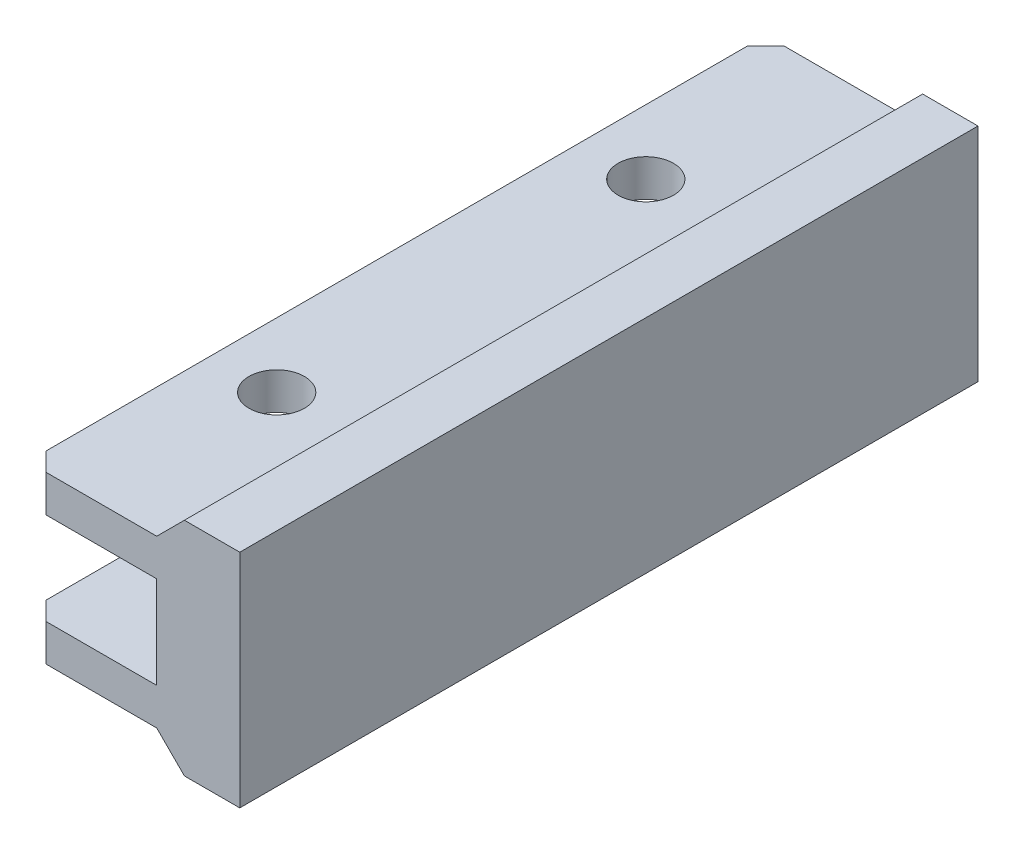
ISO-10303-21;
HEADER;
FILE_DESCRIPTION(('STEP AP214'),'2;1');
FILE_NAME('part.step','',(''),(''),'','','');
FILE_SCHEMA(('AUTOMOTIVE_DESIGN { 1 0 10303 214 1 1 1 1 }'));
ENDSEC;
DATA;
#1=APPLICATION_CONTEXT('core data for automotive mechanical design processes');
#2=APPLICATION_PROTOCOL_DEFINITION('international standard','automotive_design',2000,#1);
#3=PRODUCT_CONTEXT('',#1,'mechanical');
#4=PRODUCT('Part','Part','',(#3));
#5=PRODUCT_RELATED_PRODUCT_CATEGORY('part','',(#4));
#6=PRODUCT_DEFINITION_FORMATION('','',#4);
#7=PRODUCT_DEFINITION_CONTEXT('part definition',#1,'design');
#8=PRODUCT_DEFINITION('design','',#6,#7);
#9=PRODUCT_DEFINITION_SHAPE('','',#8);
#10=(LENGTH_UNIT() NAMED_UNIT(*) SI_UNIT(.MILLI.,.METRE.));
#11=(NAMED_UNIT(*) PLANE_ANGLE_UNIT() SI_UNIT($,.RADIAN.));
#12=(NAMED_UNIT(*) SI_UNIT($,.STERADIAN.) SOLID_ANGLE_UNIT());
#13=UNCERTAINTY_MEASURE_WITH_UNIT(LENGTH_MEASURE(1.E-05),#10,'distance_accuracy_value','');
#14=(GEOMETRIC_REPRESENTATION_CONTEXT(3) GLOBAL_UNCERTAINTY_ASSIGNED_CONTEXT((#13)) GLOBAL_UNIT_ASSIGNED_CONTEXT((#10,
#11,#12)) REPRESENTATION_CONTEXT('',''));
#15=CARTESIAN_POINT('',(0.,0.,0.));
#16=DIRECTION('',(0.,0.,1.));
#17=DIRECTION('',(1.,0.,0.));
#18=AXIS2_PLACEMENT_3D('',#15,#16,#17);
#19=CARTESIAN_POINT('',(0.,6.,20.));
#20=DIRECTION('',(0.,-1.,0.));
#21=DIRECTION('',(0.,0.,-1.));
#22=AXIS2_PLACEMENT_3D('',#19,#20,#21);
#23=PLANE('',#22);
#24=DIRECTION('',(-1.,0.,0.));
#25=VECTOR('',#24,1.);
#26=CARTESIAN_POINT('',(0.,6.,-20.));
#27=LINE('',#26,#25);
#28=CARTESIAN_POINT('',(0.,6.,-20.));
#29=VERTEX_POINT('',#28);
#30=CARTESIAN_POINT('',(-3.00000000000001,6.,-20.));
#31=VERTEX_POINT('',#30);
#32=EDGE_CURVE('E183',#29,#31,#27,.T.);
#33=ORIENTED_EDGE('',*,*,#32,.T.);
#34=DIRECTION('',(0.,0.,-1.));
#35=VECTOR('',#34,1.);
#36=CARTESIAN_POINT('',(-3.00000000000001,6.,20.));
#37=LINE('',#36,#35);
#38=CARTESIAN_POINT('',(-3.00000000000001,6.,20.));
#39=VERTEX_POINT('',#38);
#40=EDGE_CURVE('E165',#39,#31,#37,.T.);
#41=ORIENTED_EDGE('',*,*,#40,.F.);
#42=DIRECTION('',(-1.,0.,0.));
#43=VECTOR('',#42,1.);
#44=CARTESIAN_POINT('',(0.,6.,20.));
#45=LINE('',#44,#43);
#46=CARTESIAN_POINT('',(0.,6.,20.));
#47=VERTEX_POINT('',#46);
#48=EDGE_CURVE('E171',#47,#39,#45,.T.);
#49=ORIENTED_EDGE('',*,*,#48,.F.);
#50=DIRECTION('',(0.,0.,-1.));
#51=VECTOR('',#50,1.);
#52=CARTESIAN_POINT('',(0.,6.,20.));
#53=LINE('',#52,#51);
#54=EDGE_CURVE('E253',#47,#29,#53,.T.);
#55=ORIENTED_EDGE('',*,*,#54,.T.);
#56=EDGE_LOOP('',(#33,#41,#49,#55));
#57=FACE_BOUND('',#56,.T.);
#58=ADVANCED_FACE('F45',(#57),#23,.F.);
#59=CARTESIAN_POINT('',(-3.00000000000001,6.,20.));
#60=DIRECTION('',(0.707106781186549,-0.707106781186546,0.));
#61=DIRECTION('',(0.707106781186546,0.707106781186549,0.));
#62=AXIS2_PLACEMENT_3D('',#59,#60,#61);
#63=PLANE('',#62);
#64=DIRECTION('',(-0.707106781186546,-0.707106781186549,0.));
#65=VECTOR('',#64,1.);
#66=CARTESIAN_POINT('',(-3.00000000000001,6.,-20.));
#67=LINE('',#66,#65);
#68=CARTESIAN_POINT('',(-4.5,4.5,-20.));
#69=VERTEX_POINT('',#68);
#70=EDGE_CURVE('E255',#31,#69,#67,.T.);
#71=ORIENTED_EDGE('',*,*,#70,.T.);
#72=DIRECTION('',(0.,0.,-1.));
#73=VECTOR('',#72,1.);
#74=CARTESIAN_POINT('',(-4.5,4.5,20.));
#75=LINE('',#74,#73);
#76=CARTESIAN_POINT('',(-4.5,4.5,20.));
#77=VERTEX_POINT('',#76);
#78=EDGE_CURVE('E168',#77,#69,#75,.T.);
#79=ORIENTED_EDGE('',*,*,#78,.F.);
#80=DIRECTION('',(-0.707106781186546,-0.707106781186549,0.));
#81=VECTOR('',#80,1.);
#82=CARTESIAN_POINT('',(-3.00000000000001,6.,20.));
#83=LINE('',#82,#81);
#84=EDGE_CURVE('E161',#39,#77,#83,.T.);
#85=ORIENTED_EDGE('',*,*,#84,.F.);
#86=ORIENTED_EDGE('',*,*,#40,.T.);
#87=EDGE_LOOP('',(#71,#79,#85,#86));
#88=FACE_BOUND('',#87,.T.);
#89=ADVANCED_FACE('F163',(#88),#63,.F.);
#90=CARTESIAN_POINT('',(-4.5,4.5,20.));
#91=DIRECTION('',(0.,-1.,0.));
#92=DIRECTION('',(0.,0.,-1.));
#93=AXIS2_PLACEMENT_3D('',#90,#91,#92);
#94=PLANE('',#93);
#95=CARTESIAN_POINT('',(-8.,4.5,10.));
#96=DIRECTION('',(0.,1.,0.));
#97=DIRECTION('',(0.,0.,1.));
#98=AXIS2_PLACEMENT_3D('',#95,#96,#97);
#99=CIRCLE('',#98,1.5);
#100=CARTESIAN_POINT('',(-8.,4.5,11.5));
#101=VERTEX_POINT('',#100);
#102=EDGE_CURVE('E200',#101,#101,#99,.T.);
#103=ORIENTED_EDGE('',*,*,#102,.F.);
#104=EDGE_LOOP('',(#103));
#105=FACE_BOUND('',#104,.T.);
#106=CARTESIAN_POINT('',(-8.,4.5,-10.));
#107=DIRECTION('',(0.,1.,0.));
#108=DIRECTION('',(0.,0.,1.));
#109=AXIS2_PLACEMENT_3D('',#106,#107,#108);
#110=CIRCLE('',#109,1.5);
#111=CARTESIAN_POINT('',(-8.,4.5,-8.5));
#112=VERTEX_POINT('',#111);
#113=EDGE_CURVE('E196',#112,#112,#110,.T.);
#114=ORIENTED_EDGE('',*,*,#113,.F.);
#115=EDGE_LOOP('',(#114));
#116=FACE_BOUND('',#115,.T.);
#117=DIRECTION('',(-1.,0.,0.));
#118=VECTOR('',#117,1.);
#119=CARTESIAN_POINT('',(-4.5,4.5,-20.));
#120=LINE('',#119,#118);
#121=CARTESIAN_POINT('',(-10.5,4.5,-20.));
#122=VERTEX_POINT('',#121);
#123=EDGE_CURVE('E258',#69,#122,#120,.T.);
#124=ORIENTED_EDGE('',*,*,#123,.T.);
#125=DIRECTION('',(0.707106781186548,0.,-0.707106781186548));
#126=VECTOR('',#125,1.);
#127=CARTESIAN_POINT('',(-11.5,4.5,-19.));
#128=LINE('',#127,#126);
#129=CARTESIAN_POINT('',(-11.5,4.5,-19.));
#130=VERTEX_POINT('',#129);
#131=EDGE_CURVE('E225',#122,#130,#128,.F.);
#132=ORIENTED_EDGE('',*,*,#131,.T.);
#133=DIRECTION('',(0.,0.,-1.));
#134=VECTOR('',#133,1.);
#135=CARTESIAN_POINT('',(-11.5,4.5,20.));
#136=LINE('',#135,#134);
#137=CARTESIAN_POINT('',(-11.5,4.5,19.));
#138=VERTEX_POINT('',#137);
#139=EDGE_CURVE('E188',#138,#130,#136,.T.);
#140=ORIENTED_EDGE('',*,*,#139,.F.);
#141=DIRECTION('',(0.707106781186548,0.,0.707106781186548));
#142=VECTOR('',#141,1.);
#143=CARTESIAN_POINT('',(-10.5,4.5,20.));
#144=LINE('',#143,#142);
#145=CARTESIAN_POINT('',(-10.5,4.5,20.));
#146=VERTEX_POINT('',#145);
#147=EDGE_CURVE('E61',#138,#146,#144,.T.);
#148=ORIENTED_EDGE('',*,*,#147,.T.);
#149=DIRECTION('',(-1.,0.,0.));
#150=VECTOR('',#149,1.);
#151=CARTESIAN_POINT('',(-4.5,4.5,20.));
#152=LINE('',#151,#150);
#153=EDGE_CURVE('E170',#77,#146,#152,.T.);
#154=ORIENTED_EDGE('',*,*,#153,.F.);
#155=ORIENTED_EDGE('',*,*,#78,.T.);
#156=EDGE_LOOP('',(#124,#132,#140,#148,#154,#155));
#157=FACE_BOUND('',#156,.T.);
#158=ADVANCED_FACE('F351',(#105,#116,#157),#94,.F.);
#159=CARTESIAN_POINT('',(-11.5,4.5,20.));
#160=DIRECTION('',(1.,0.,0.));
#161=DIRECTION('',(0.,0.,-1.));
#162=AXIS2_PLACEMENT_3D('',#159,#160,#161);
#163=PLANE('',#162);
#164=ORIENTED_EDGE('',*,*,#139,.T.);
#165=DIRECTION('',(0.,-1.,0.));
#166=VECTOR('',#165,1.);
#167=CARTESIAN_POINT('',(-11.5,4.5,-19.));
#168=LINE('',#167,#166);
#169=CARTESIAN_POINT('',(-11.5,2.5,-19.));
#170=VERTEX_POINT('',#169);
#171=EDGE_CURVE('E218',#130,#170,#168,.T.);
#172=ORIENTED_EDGE('',*,*,#171,.T.);
#173=DIRECTION('',(0.,0.,-1.));
#174=VECTOR('',#173,1.);
#175=CARTESIAN_POINT('',(-11.5,2.5,20.));
#176=LINE('',#175,#174);
#177=CARTESIAN_POINT('',(-11.5,2.5,19.));
#178=VERTEX_POINT('',#177);
#179=EDGE_CURVE('E294',#178,#170,#176,.T.);
#180=ORIENTED_EDGE('',*,*,#179,.F.);
#181=DIRECTION('',(0.,1.,0.));
#182=VECTOR('',#181,1.);
#183=CARTESIAN_POINT('',(-11.5,4.5,19.));
#184=LINE('',#183,#182);
#185=EDGE_CURVE('E216',#178,#138,#184,.T.);
#186=ORIENTED_EDGE('',*,*,#185,.T.);
#187=EDGE_LOOP('',(#164,#172,#180,#186));
#188=FACE_BOUND('',#187,.T.);
#189=ADVANCED_FACE('F299',(#188),#163,.F.);
#190=CARTESIAN_POINT('',(-4.5,2.5,20.));
#191=DIRECTION('',(0.,1.,0.));
#192=DIRECTION('',(0.,0.,1.));
#193=AXIS2_PLACEMENT_3D('',#190,#191,#192);
#194=PLANE('',#193);
#195=CARTESIAN_POINT('',(-8.,2.5,10.));
#196=DIRECTION('',(0.,1.,0.));
#197=DIRECTION('',(0.,0.,1.));
#198=AXIS2_PLACEMENT_3D('',#195,#196,#197);
#199=CIRCLE('',#198,1.5);
#200=CARTESIAN_POINT('',(-8.,2.5,11.5));
#201=VERTEX_POINT('',#200);
#202=EDGE_CURVE('E554',#201,#201,#199,.T.);
#203=ORIENTED_EDGE('',*,*,#202,.T.);
#204=EDGE_LOOP('',(#203));
#205=FACE_BOUND('',#204,.T.);
#206=CARTESIAN_POINT('',(-8.,2.5,-10.));
#207=DIRECTION('',(0.,1.,0.));
#208=DIRECTION('',(0.,0.,1.));
#209=AXIS2_PLACEMENT_3D('',#206,#207,#208);
#210=CIRCLE('',#209,1.5);
#211=CARTESIAN_POINT('',(-8.,2.5,-8.5));
#212=VERTEX_POINT('',#211);
#213=EDGE_CURVE('E256',#212,#212,#210,.T.);
#214=ORIENTED_EDGE('',*,*,#213,.T.);
#215=EDGE_LOOP('',(#214));
#216=FACE_BOUND('',#215,.T.);
#217=ORIENTED_EDGE('',*,*,#179,.T.);
#218=DIRECTION('',(-0.707106781186548,0.,0.707106781186548));
#219=VECTOR('',#218,1.);
#220=CARTESIAN_POINT('',(-11.5,2.5,-19.));
#221=LINE('',#220,#219);
#222=CARTESIAN_POINT('',(-10.5,2.5,-20.));
#223=VERTEX_POINT('',#222);
#224=EDGE_CURVE('E222',#170,#223,#221,.F.);
#225=ORIENTED_EDGE('',*,*,#224,.T.);
#226=DIRECTION('',(1.,0.,0.));
#227=VECTOR('',#226,1.);
#228=CARTESIAN_POINT('',(-4.5,2.5,-20.));
#229=LINE('',#228,#227);
#230=CARTESIAN_POINT('',(-4.5,2.5,-20.));
#231=VERTEX_POINT('',#230);
#232=EDGE_CURVE('E261',#223,#231,#229,.T.);
#233=ORIENTED_EDGE('',*,*,#232,.T.);
#234=DIRECTION('',(0.,0.,-1.));
#235=VECTOR('',#234,1.);
#236=CARTESIAN_POINT('',(-4.5,2.5,20.));
#237=LINE('',#236,#235);
#238=CARTESIAN_POINT('',(-4.5,2.5,20.));
#239=VERTEX_POINT('',#238);
#240=EDGE_CURVE('E291',#239,#231,#237,.T.);
#241=ORIENTED_EDGE('',*,*,#240,.F.);
#242=DIRECTION('',(1.,0.,0.));
#243=VECTOR('',#242,1.);
#244=CARTESIAN_POINT('',(-4.5,2.5,20.));
#245=LINE('',#244,#243);
#246=CARTESIAN_POINT('',(-10.5,2.5,20.));
#247=VERTEX_POINT('',#246);
#248=EDGE_CURVE('E409',#247,#239,#245,.T.);
#249=ORIENTED_EDGE('',*,*,#248,.F.);
#250=DIRECTION('',(-0.707106781186548,0.,-0.707106781186548));
#251=VECTOR('',#250,1.);
#252=CARTESIAN_POINT('',(-10.5,2.5,20.));
#253=LINE('',#252,#251);
#254=EDGE_CURVE('E69',#247,#178,#253,.T.);
#255=ORIENTED_EDGE('',*,*,#254,.T.);
#256=EDGE_LOOP('',(#217,#225,#233,#241,#249,#255));
#257=FACE_BOUND('',#256,.T.);
#258=ADVANCED_FACE('F307',(#205,#216,#257),#194,.F.);
#259=CARTESIAN_POINT('',(-4.5,-2.5,20.));
#260=DIRECTION('',(1.,0.,0.));
#261=DIRECTION('',(0.,0.,-1.));
#262=AXIS2_PLACEMENT_3D('',#259,#260,#261);
#263=PLANE('',#262);
#264=DIRECTION('',(0.,-1.,0.));
#265=VECTOR('',#264,1.);
#266=CARTESIAN_POINT('',(-4.5,-2.5,-20.));
#267=LINE('',#266,#265);
#268=CARTESIAN_POINT('',(-4.5,-2.5,-20.));
#269=VERTEX_POINT('',#268);
#270=EDGE_CURVE('E263',#231,#269,#267,.T.);
#271=ORIENTED_EDGE('',*,*,#270,.T.);
#272=DIRECTION('',(0.,0.,-1.));
#273=VECTOR('',#272,1.);
#274=CARTESIAN_POINT('',(-4.5,-2.5,20.));
#275=LINE('',#274,#273);
#276=CARTESIAN_POINT('',(-4.5,-2.5,20.));
#277=VERTEX_POINT('',#276);
#278=EDGE_CURVE('E288',#277,#269,#275,.T.);
#279=ORIENTED_EDGE('',*,*,#278,.F.);
#280=DIRECTION('',(0.,-1.,0.));
#281=VECTOR('',#280,1.);
#282=CARTESIAN_POINT('',(-4.5,-2.5,20.));
#283=LINE('',#282,#281);
#284=EDGE_CURVE('E247',#239,#277,#283,.T.);
#285=ORIENTED_EDGE('',*,*,#284,.F.);
#286=ORIENTED_EDGE('',*,*,#240,.T.);
#287=EDGE_LOOP('',(#271,#279,#285,#286));
#288=FACE_BOUND('',#287,.T.);
#289=ADVANCED_FACE('F317',(#288),#263,.F.);
#290=CARTESIAN_POINT('',(-4.5,-2.5,20.));
#291=DIRECTION('',(0.,-1.,0.));
#292=DIRECTION('',(0.,0.,-1.));
#293=AXIS2_PLACEMENT_3D('',#290,#291,#292);
#294=PLANE('',#293);
#295=CARTESIAN_POINT('',(-8.,-2.5,10.));
#296=DIRECTION('',(0.,-1.,0.));
#297=DIRECTION('',(0.,0.,-1.));
#298=AXIS2_PLACEMENT_3D('',#295,#296,#297);
#299=CIRCLE('',#298,1.5);
#300=CARTESIAN_POINT('',(-8.,-2.5,8.5));
#301=VERTEX_POINT('',#300);
#302=EDGE_CURVE('E199',#301,#301,#299,.T.);
#303=ORIENTED_EDGE('',*,*,#302,.T.);
#304=EDGE_LOOP('',(#303));
#305=FACE_BOUND('',#304,.T.);
#306=CARTESIAN_POINT('',(-8.,-2.5,-10.));
#307=DIRECTION('',(0.,-1.,0.));
#308=DIRECTION('',(0.,0.,-1.));
#309=AXIS2_PLACEMENT_3D('',#306,#307,#308);
#310=CIRCLE('',#309,1.5);
#311=CARTESIAN_POINT('',(-8.,-2.5,-11.5));
#312=VERTEX_POINT('',#311);
#313=EDGE_CURVE('E195',#312,#312,#310,.T.);
#314=ORIENTED_EDGE('',*,*,#313,.T.);
#315=EDGE_LOOP('',(#314));
#316=FACE_BOUND('',#315,.T.);
#317=DIRECTION('',(-1.,0.,0.));
#318=VECTOR('',#317,1.);
#319=CARTESIAN_POINT('',(-4.5,-2.5,-20.));
#320=LINE('',#319,#318);
#321=CARTESIAN_POINT('',(-10.5,-2.5,-20.));
#322=VERTEX_POINT('',#321);
#323=EDGE_CURVE('E265',#269,#322,#320,.T.);
#324=ORIENTED_EDGE('',*,*,#323,.T.);
#325=DIRECTION('',(0.707106781186548,0.,-0.707106781186548));
#326=VECTOR('',#325,1.);
#327=CARTESIAN_POINT('',(-11.5,-2.5,-19.));
#328=LINE('',#327,#326);
#329=CARTESIAN_POINT('',(-11.5,-2.5,-19.));
#330=VERTEX_POINT('',#329);
#331=EDGE_CURVE('E214',#322,#330,#328,.F.);
#332=ORIENTED_EDGE('',*,*,#331,.T.);
#333=DIRECTION('',(0.,0.,-1.));
#334=VECTOR('',#333,1.);
#335=CARTESIAN_POINT('',(-11.5,-2.5,20.));
#336=LINE('',#335,#334);
#337=CARTESIAN_POINT('',(-11.5,-2.5,19.));
#338=VERTEX_POINT('',#337);
#339=EDGE_CURVE('E285',#338,#330,#336,.T.);
#340=ORIENTED_EDGE('',*,*,#339,.F.);
#341=DIRECTION('',(0.707106781186548,0.,0.707106781186548));
#342=VECTOR('',#341,1.);
#343=CARTESIAN_POINT('',(-10.5,-2.5,20.));
#344=LINE('',#343,#342);
#345=CARTESIAN_POINT('',(-10.5,-2.5,20.));
#346=VERTEX_POINT('',#345);
#347=EDGE_CURVE('E212',#338,#346,#344,.T.);
#348=ORIENTED_EDGE('',*,*,#347,.T.);
#349=DIRECTION('',(-1.,0.,0.));
#350=VECTOR('',#349,1.);
#351=CARTESIAN_POINT('',(-4.5,-2.5,20.));
#352=LINE('',#351,#350);
#353=EDGE_CURVE('E233',#277,#346,#352,.T.);
#354=ORIENTED_EDGE('',*,*,#353,.F.);
#355=ORIENTED_EDGE('',*,*,#278,.T.);
#356=EDGE_LOOP('',(#324,#332,#340,#348,#354,#355));
#357=FACE_BOUND('',#356,.T.);
#358=ADVANCED_FACE('F320',(#305,#316,#357),#294,.F.);
#359=CARTESIAN_POINT('',(-11.5,-4.5,20.));
#360=DIRECTION('',(1.,0.,0.));
#361=DIRECTION('',(0.,0.,-1.));
#362=AXIS2_PLACEMENT_3D('',#359,#360,#361);
#363=PLANE('',#362);
#364=ORIENTED_EDGE('',*,*,#339,.T.);
#365=DIRECTION('',(0.,-1.,0.));
#366=VECTOR('',#365,1.);
#367=CARTESIAN_POINT('',(-11.5,-4.5,-19.));
#368=LINE('',#367,#366);
#369=CARTESIAN_POINT('',(-11.5,-4.5,-19.));
#370=VERTEX_POINT('',#369);
#371=EDGE_CURVE('E186',#330,#370,#368,.T.);
#372=ORIENTED_EDGE('',*,*,#371,.T.);
#373=DIRECTION('',(0.,0.,-1.));
#374=VECTOR('',#373,1.);
#375=CARTESIAN_POINT('',(-11.5,-4.5,20.));
#376=LINE('',#375,#374);
#377=CARTESIAN_POINT('',(-11.5,-4.5,19.));
#378=VERTEX_POINT('',#377);
#379=EDGE_CURVE('E283',#378,#370,#376,.T.);
#380=ORIENTED_EDGE('',*,*,#379,.F.);
#381=DIRECTION('',(0.,1.,0.));
#382=VECTOR('',#381,1.);
#383=CARTESIAN_POINT('',(-11.5,-2.5,19.));
#384=LINE('',#383,#382);
#385=EDGE_CURVE('E184',#378,#338,#384,.T.);
#386=ORIENTED_EDGE('',*,*,#385,.T.);
#387=EDGE_LOOP('',(#364,#372,#380,#386));
#388=FACE_BOUND('',#387,.T.);
#389=ADVANCED_FACE('F325',(#388),#363,.F.);
#390=CARTESIAN_POINT('',(-4.5,-4.5,20.));
#391=DIRECTION('',(0.,1.,0.));
#392=DIRECTION('',(0.,0.,1.));
#393=AXIS2_PLACEMENT_3D('',#390,#391,#392);
#394=PLANE('',#393);
#395=CARTESIAN_POINT('',(-8.,-4.5,10.));
#396=DIRECTION('',(0.,1.,0.));
#397=DIRECTION('',(0.,0.,1.));
#398=AXIS2_PLACEMENT_3D('',#395,#396,#397);
#399=CIRCLE('',#398,1.5);
#400=CARTESIAN_POINT('',(-8.,-4.5,11.5));
#401=VERTEX_POINT('',#400);
#402=EDGE_CURVE('E197',#401,#401,#399,.T.);
#403=ORIENTED_EDGE('',*,*,#402,.T.);
#404=EDGE_LOOP('',(#403));
#405=FACE_BOUND('',#404,.T.);
#406=CARTESIAN_POINT('',(-8.,-4.5,-10.));
#407=DIRECTION('',(0.,1.,0.));
#408=DIRECTION('',(0.,0.,1.));
#409=AXIS2_PLACEMENT_3D('',#406,#407,#408);
#410=CIRCLE('',#409,1.5);
#411=CARTESIAN_POINT('',(-8.,-4.5,-8.5));
#412=VERTEX_POINT('',#411);
#413=EDGE_CURVE('E192',#412,#412,#410,.T.);
#414=ORIENTED_EDGE('',*,*,#413,.T.);
#415=EDGE_LOOP('',(#414));
#416=FACE_BOUND('',#415,.T.);
#417=ORIENTED_EDGE('',*,*,#379,.T.);
#418=DIRECTION('',(-0.707106781186548,0.,0.707106781186548));
#419=VECTOR('',#418,1.);
#420=CARTESIAN_POINT('',(-11.5,-4.5,-19.));
#421=LINE('',#420,#419);
#422=CARTESIAN_POINT('',(-10.5,-4.5,-20.));
#423=VERTEX_POINT('',#422);
#424=EDGE_CURVE('E206',#370,#423,#421,.F.);
#425=ORIENTED_EDGE('',*,*,#424,.T.);
#426=DIRECTION('',(1.,0.,0.));
#427=VECTOR('',#426,1.);
#428=CARTESIAN_POINT('',(-4.5,-4.5,-20.));
#429=LINE('',#428,#427);
#430=CARTESIAN_POINT('',(-4.5,-4.5,-20.));
#431=VERTEX_POINT('',#430);
#432=EDGE_CURVE('E268',#423,#431,#429,.T.);
#433=ORIENTED_EDGE('',*,*,#432,.T.);
#434=DIRECTION('',(0.,0.,-1.));
#435=VECTOR('',#434,1.);
#436=CARTESIAN_POINT('',(-4.5,-4.5,20.));
#437=LINE('',#436,#435);
#438=CARTESIAN_POINT('',(-4.5,-4.5,20.));
#439=VERTEX_POINT('',#438);
#440=EDGE_CURVE('E241',#439,#431,#437,.T.);
#441=ORIENTED_EDGE('',*,*,#440,.F.);
#442=DIRECTION('',(1.,0.,0.));
#443=VECTOR('',#442,1.);
#444=CARTESIAN_POINT('',(-4.5,-4.5,20.));
#445=LINE('',#444,#443);
#446=CARTESIAN_POINT('',(-10.5,-4.5,20.));
#447=VERTEX_POINT('',#446);
#448=EDGE_CURVE('E230',#447,#439,#445,.T.);
#449=ORIENTED_EDGE('',*,*,#448,.F.);
#450=DIRECTION('',(-0.707106781186548,0.,-0.707106781186548));
#451=VECTOR('',#450,1.);
#452=CARTESIAN_POINT('',(-10.5,-4.5,20.));
#453=LINE('',#452,#451);
#454=EDGE_CURVE('E204',#447,#378,#453,.T.);
#455=ORIENTED_EDGE('',*,*,#454,.T.);
#456=EDGE_LOOP('',(#417,#425,#433,#441,#449,#455));
#457=FACE_BOUND('',#456,.T.);
#458=ADVANCED_FACE('F238',(#405,#416,#457),#394,.F.);
#459=CARTESIAN_POINT('',(-3.00000000000001,-6.,20.));
#460=DIRECTION('',(0.707106781186549,0.707106781186546,0.));
#461=DIRECTION('',(-0.707106781186546,0.707106781186549,0.));
#462=AXIS2_PLACEMENT_3D('',#459,#460,#461);
#463=PLANE('',#462);
#464=DIRECTION('',(0.707106781186546,-0.707106781186549,0.));
#465=VECTOR('',#464,1.);
#466=CARTESIAN_POINT('',(-3.00000000000001,-6.,-20.));
#467=LINE('',#466,#465);
#468=CARTESIAN_POINT('',(-3.00000000000001,-6.,-20.));
#469=VERTEX_POINT('',#468);
#470=EDGE_CURVE('E270',#431,#469,#467,.T.);
#471=ORIENTED_EDGE('',*,*,#470,.T.);
#472=DIRECTION('',(0.,0.,-1.));
#473=VECTOR('',#472,1.);
#474=CARTESIAN_POINT('',(-3.00000000000001,-6.,20.));
#475=LINE('',#474,#473);
#476=CARTESIAN_POINT('',(-3.00000000000001,-6.,20.));
#477=VERTEX_POINT('',#476);
#478=EDGE_CURVE('E279',#477,#469,#475,.T.);
#479=ORIENTED_EDGE('',*,*,#478,.F.);
#480=DIRECTION('',(0.707106781186546,-0.707106781186549,0.));
#481=VECTOR('',#480,1.);
#482=CARTESIAN_POINT('',(-3.00000000000001,-6.,20.));
#483=LINE('',#482,#481);
#484=EDGE_CURVE('E243',#439,#477,#483,.T.);
#485=ORIENTED_EDGE('',*,*,#484,.F.);
#486=ORIENTED_EDGE('',*,*,#440,.T.);
#487=EDGE_LOOP('',(#471,#479,#485,#486));
#488=FACE_BOUND('',#487,.T.);
#489=ADVANCED_FACE('F371',(#488),#463,.F.);
#490=CARTESIAN_POINT('',(0.,-6.,20.));
#491=DIRECTION('',(0.,1.,0.));
#492=DIRECTION('',(0.,0.,1.));
#493=AXIS2_PLACEMENT_3D('',#490,#491,#492);
#494=PLANE('',#493);
#495=DIRECTION('',(1.,0.,0.));
#496=VECTOR('',#495,1.);
#497=CARTESIAN_POINT('',(0.,-6.,-20.));
#498=LINE('',#497,#496);
#499=CARTESIAN_POINT('',(0.,-6.,-20.));
#500=VERTEX_POINT('',#499);
#501=EDGE_CURVE('E272',#469,#500,#498,.T.);
#502=ORIENTED_EDGE('',*,*,#501,.T.);
#503=DIRECTION('',(0.,0.,-1.));
#504=VECTOR('',#503,1.);
#505=CARTESIAN_POINT('',(0.,-6.,20.));
#506=LINE('',#505,#504);
#507=CARTESIAN_POINT('',(0.,-6.,20.));
#508=VERTEX_POINT('',#507);
#509=EDGE_CURVE('E276',#508,#500,#506,.T.);
#510=ORIENTED_EDGE('',*,*,#509,.F.);
#511=DIRECTION('',(1.,0.,0.));
#512=VECTOR('',#511,1.);
#513=CARTESIAN_POINT('',(0.,-6.,20.));
#514=LINE('',#513,#512);
#515=EDGE_CURVE('E245',#477,#508,#514,.T.);
#516=ORIENTED_EDGE('',*,*,#515,.F.);
#517=ORIENTED_EDGE('',*,*,#478,.T.);
#518=EDGE_LOOP('',(#502,#510,#516,#517));
#519=FACE_BOUND('',#518,.T.);
#520=ADVANCED_FACE('F375',(#519),#494,.F.);
#521=CARTESIAN_POINT('',(0.,-6.,20.));
#522=DIRECTION('',(-1.,0.,0.));
#523=DIRECTION('',(0.,0.,1.));
#524=AXIS2_PLACEMENT_3D('',#521,#522,#523);
#525=PLANE('',#524);
#526=DIRECTION('',(0.,1.,0.));
#527=VECTOR('',#526,1.);
#528=CARTESIAN_POINT('',(0.,-6.,-20.));
#529=LINE('',#528,#527);
#530=EDGE_CURVE('E180',#500,#29,#529,.T.);
#531=ORIENTED_EDGE('',*,*,#530,.T.);
#532=ORIENTED_EDGE('',*,*,#54,.F.);
#533=DIRECTION('',(0.,1.,0.));
#534=VECTOR('',#533,1.);
#535=CARTESIAN_POINT('',(0.,-6.,20.));
#536=LINE('',#535,#534);
#537=EDGE_CURVE('E176',#508,#47,#536,.T.);
#538=ORIENTED_EDGE('',*,*,#537,.F.);
#539=ORIENTED_EDGE('',*,*,#509,.T.);
#540=EDGE_LOOP('',(#531,#532,#538,#539));
#541=FACE_BOUND('',#540,.T.);
#542=ADVANCED_FACE('F379',(#541),#525,.F.);
#543=CARTESIAN_POINT('',(0.,0.,20.));
#544=DIRECTION('',(0.,0.,1.));
#545=DIRECTION('',(1.,0.,0.));
#546=AXIS2_PLACEMENT_3D('',#543,#544,#545);
#547=PLANE('',#546);
#548=ORIENTED_EDGE('',*,*,#153,.T.);
#549=DIRECTION('',(0.,-1.,0.));
#550=VECTOR('',#549,1.);
#551=CARTESIAN_POINT('',(-10.5,2.5,20.));
#552=LINE('',#551,#550);
#553=EDGE_CURVE('E11',#146,#247,#552,.T.);
#554=ORIENTED_EDGE('',*,*,#553,.T.);
#555=ORIENTED_EDGE('',*,*,#248,.T.);
#556=ORIENTED_EDGE('',*,*,#284,.T.);
#557=ORIENTED_EDGE('',*,*,#353,.T.);
#558=DIRECTION('',(0.,-1.,0.));
#559=VECTOR('',#558,1.);
#560=CARTESIAN_POINT('',(-10.5,-4.5,20.));
#561=LINE('',#560,#559);
#562=EDGE_CURVE('E54',#346,#447,#561,.T.);
#563=ORIENTED_EDGE('',*,*,#562,.T.);
#564=ORIENTED_EDGE('',*,*,#448,.T.);
#565=ORIENTED_EDGE('',*,*,#484,.T.);
#566=ORIENTED_EDGE('',*,*,#515,.T.);
#567=ORIENTED_EDGE('',*,*,#537,.T.);
#568=ORIENTED_EDGE('',*,*,#48,.T.);
#569=ORIENTED_EDGE('',*,*,#84,.T.);
#570=EDGE_LOOP('',(#548,#554,#555,#556,#557,#563,#564,#565,#566,#567,#568,#569));
#571=FACE_BOUND('',#570,.T.);
#572=ADVANCED_FACE('F174',(#571),#547,.T.);
#573=CARTESIAN_POINT('',(0.,0.,-20.));
#574=DIRECTION('',(0.,0.,1.));
#575=DIRECTION('',(1.,0.,0.));
#576=AXIS2_PLACEMENT_3D('',#573,#574,#575);
#577=PLANE('',#576);
#578=ORIENTED_EDGE('',*,*,#432,.F.);
#579=DIRECTION('',(0.,1.,0.));
#580=VECTOR('',#579,1.);
#581=CARTESIAN_POINT('',(-10.5,0.,-20.));
#582=LINE('',#581,#580);
#583=EDGE_CURVE('E210',#423,#322,#582,.T.);
#584=ORIENTED_EDGE('',*,*,#583,.T.);
#585=ORIENTED_EDGE('',*,*,#323,.F.);
#586=ORIENTED_EDGE('',*,*,#270,.F.);
#587=ORIENTED_EDGE('',*,*,#232,.F.);
#588=DIRECTION('',(0.,1.,0.));
#589=VECTOR('',#588,1.);
#590=CARTESIAN_POINT('',(-10.5,0.,-20.));
#591=LINE('',#590,#589);
#592=EDGE_CURVE('E208',#223,#122,#591,.T.);
#593=ORIENTED_EDGE('',*,*,#592,.T.);
#594=ORIENTED_EDGE('',*,*,#123,.F.);
#595=ORIENTED_EDGE('',*,*,#70,.F.);
#596=ORIENTED_EDGE('',*,*,#32,.F.);
#597=ORIENTED_EDGE('',*,*,#530,.F.);
#598=ORIENTED_EDGE('',*,*,#501,.F.);
#599=ORIENTED_EDGE('',*,*,#470,.F.);
#600=EDGE_LOOP('',(#578,#584,#585,#586,#587,#593,#594,#595,#596,#597,#598,#599));
#601=FACE_BOUND('',#600,.T.);
#602=ADVANCED_FACE('F312',(#601),#577,.F.);
#603=CARTESIAN_POINT('',(-8.,4.5,-10.));
#604=DIRECTION('',(0.,1.,0.));
#605=DIRECTION('',(0.,0.,1.));
#606=AXIS2_PLACEMENT_3D('',#603,#604,#605);
#607=CYLINDRICAL_SURFACE('',#606,1.5);
#608=ORIENTED_EDGE('',*,*,#413,.F.);
#609=EDGE_LOOP('',(#608));
#610=FACE_BOUND('',#609,.T.);
#611=ORIENTED_EDGE('',*,*,#313,.F.);
#612=EDGE_LOOP('',(#611));
#613=FACE_BOUND('',#612,.T.);
#614=ADVANCED_FACE('F385',(#610,#613),#607,.F.);
#615=ORIENTED_EDGE('',*,*,#113,.T.);
#616=EDGE_LOOP('',(#615));
#617=FACE_BOUND('',#616,.T.);
#618=ORIENTED_EDGE('',*,*,#213,.F.);
#619=EDGE_LOOP('',(#618));
#620=FACE_BOUND('',#619,.T.);
#621=ADVANCED_FACE('F388',(#617,#620),#607,.F.);
#622=CARTESIAN_POINT('',(-8.,4.5,10.));
#623=DIRECTION('',(0.,1.,0.));
#624=DIRECTION('',(0.,0.,1.));
#625=AXIS2_PLACEMENT_3D('',#622,#623,#624);
#626=CYLINDRICAL_SURFACE('',#625,1.5);
#627=ORIENTED_EDGE('',*,*,#402,.F.);
#628=EDGE_LOOP('',(#627));
#629=FACE_BOUND('',#628,.T.);
#630=ORIENTED_EDGE('',*,*,#302,.F.);
#631=EDGE_LOOP('',(#630));
#632=FACE_BOUND('',#631,.T.);
#633=ADVANCED_FACE('F342',(#629,#632),#626,.F.);
#634=ORIENTED_EDGE('',*,*,#102,.T.);
#635=EDGE_LOOP('',(#634));
#636=FACE_BOUND('',#635,.T.);
#637=ORIENTED_EDGE('',*,*,#202,.F.);
#638=EDGE_LOOP('',(#637));
#639=FACE_BOUND('',#638,.T.);
#640=ADVANCED_FACE('F333',(#636,#639),#626,.F.);
#641=CARTESIAN_POINT('',(-11.5,-4.5,-19.));
#642=DIRECTION('',(0.707106781186547,0.,0.707106781186547));
#643=DIRECTION('',(0.,-1.,0.));
#644=AXIS2_PLACEMENT_3D('',#641,#642,#643);
#645=PLANE('',#644);
#646=ORIENTED_EDGE('',*,*,#331,.F.);
#647=ORIENTED_EDGE('',*,*,#583,.F.);
#648=ORIENTED_EDGE('',*,*,#424,.F.);
#649=ORIENTED_EDGE('',*,*,#371,.F.);
#650=EDGE_LOOP('',(#646,#647,#648,#649));
#651=FACE_BOUND('',#650,.T.);
#652=ADVANCED_FACE('F331',(#651),#645,.F.);
#653=CARTESIAN_POINT('',(-11.5,4.5,-19.));
#654=DIRECTION('',(0.707106781186547,0.,0.707106781186547));
#655=DIRECTION('',(0.,-1.,0.));
#656=AXIS2_PLACEMENT_3D('',#653,#654,#655);
#657=PLANE('',#656);
#658=ORIENTED_EDGE('',*,*,#131,.F.);
#659=ORIENTED_EDGE('',*,*,#592,.F.);
#660=ORIENTED_EDGE('',*,*,#224,.F.);
#661=ORIENTED_EDGE('',*,*,#171,.F.);
#662=EDGE_LOOP('',(#658,#659,#660,#661));
#663=FACE_BOUND('',#662,.T.);
#664=ADVANCED_FACE('F303',(#663),#657,.F.);
#665=CARTESIAN_POINT('',(-10.5,0.,20.));
#666=DIRECTION('',(-0.707106781186547,0.,0.707106781186547));
#667=DIRECTION('',(0.,1.,0.));
#668=AXIS2_PLACEMENT_3D('',#665,#666,#667);
#669=PLANE('',#668);
#670=ORIENTED_EDGE('',*,*,#147,.F.);
#671=ORIENTED_EDGE('',*,*,#185,.F.);
#672=ORIENTED_EDGE('',*,*,#254,.F.);
#673=ORIENTED_EDGE('',*,*,#553,.F.);
#674=EDGE_LOOP('',(#670,#671,#672,#673));
#675=FACE_BOUND('',#674,.T.);
#676=ADVANCED_FACE('F339',(#675),#669,.T.);
#677=CARTESIAN_POINT('',(-10.5,0.,20.));
#678=DIRECTION('',(-0.707106781186547,0.,0.707106781186547));
#679=DIRECTION('',(0.,1.,0.));
#680=AXIS2_PLACEMENT_3D('',#677,#678,#679);
#681=PLANE('',#680);
#682=ORIENTED_EDGE('',*,*,#347,.F.);
#683=ORIENTED_EDGE('',*,*,#385,.F.);
#684=ORIENTED_EDGE('',*,*,#454,.F.);
#685=ORIENTED_EDGE('',*,*,#562,.F.);
#686=EDGE_LOOP('',(#682,#683,#684,#685));
#687=FACE_BOUND('',#686,.T.);
#688=ADVANCED_FACE('F48',(#687),#681,.T.);
#689=CLOSED_SHELL('',(#58,#89,#158,#189,#258,#289,#358,#389,#458,#489,#520,#542,#572,#602,#614,
#621,#633,#640,#652,#664,#676,#688));
#690=MANIFOLD_SOLID_BREP('B2',#689);
#691=ADVANCED_BREP_SHAPE_REPRESENTATION('',(#18,#690),#14);
#692=SHAPE_DEFINITION_REPRESENTATION(#9,#691);
ENDSEC;
END-ISO-10303-21;
